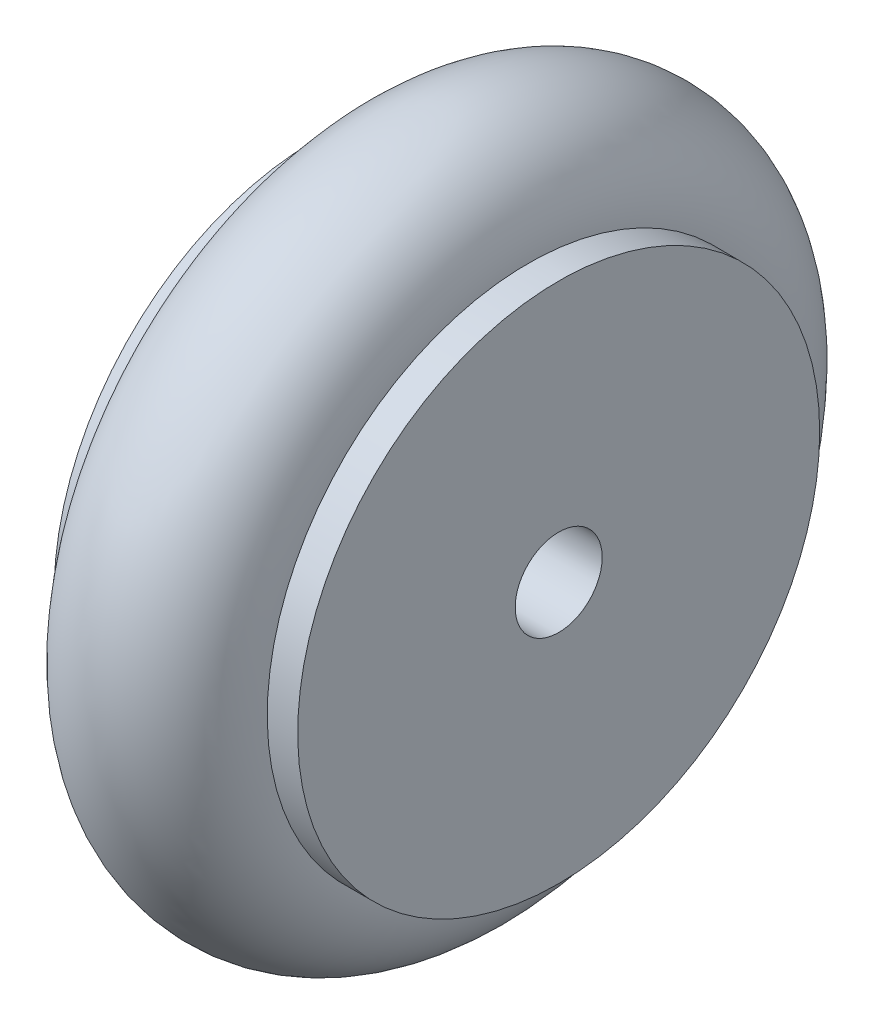
ISO-10303-21;
HEADER;
FILE_DESCRIPTION(('STEP AP214'),'2;1');
FILE_NAME('part.step','',(''),(''),'','','');
FILE_SCHEMA(('AUTOMOTIVE_DESIGN { 1 0 10303 214 1 1 1 1 }'));
ENDSEC;
DATA;
#1=APPLICATION_CONTEXT('core data for automotive mechanical design processes');
#2=APPLICATION_PROTOCOL_DEFINITION('international standard','automotive_design',2000,#1);
#3=PRODUCT_CONTEXT('',#1,'mechanical');
#4=PRODUCT('Part','Part','',(#3));
#5=PRODUCT_RELATED_PRODUCT_CATEGORY('part','',(#4));
#6=PRODUCT_DEFINITION_FORMATION('','',#4);
#7=PRODUCT_DEFINITION_CONTEXT('part definition',#1,'design');
#8=PRODUCT_DEFINITION('design','',#6,#7);
#9=PRODUCT_DEFINITION_SHAPE('','',#8);
#10=(LENGTH_UNIT() NAMED_UNIT(*) SI_UNIT(.MILLI.,.METRE.));
#11=(NAMED_UNIT(*) PLANE_ANGLE_UNIT() SI_UNIT($,.RADIAN.));
#12=(NAMED_UNIT(*) SI_UNIT($,.STERADIAN.) SOLID_ANGLE_UNIT());
#13=UNCERTAINTY_MEASURE_WITH_UNIT(LENGTH_MEASURE(1.E-05),#10,'distance_accuracy_value','');
#14=(GEOMETRIC_REPRESENTATION_CONTEXT(3) GLOBAL_UNCERTAINTY_ASSIGNED_CONTEXT((#13)) GLOBAL_UNIT_ASSIGNED_CONTEXT((#10,
#11,#12)) REPRESENTATION_CONTEXT('',''));
#15=CARTESIAN_POINT('',(0.,0.,0.));
#16=DIRECTION('',(0.,0.,1.));
#17=DIRECTION('',(1.,0.,0.));
#18=AXIS2_PLACEMENT_3D('',#15,#16,#17);
#19=CARTESIAN_POINT('',(2.8,0.,0.));
#20=DIRECTION('',(-1.,0.,0.));
#21=DIRECTION('',(0.,0.,1.));
#22=AXIS2_PLACEMENT_3D('',#19,#20,#21);
#23=CYLINDRICAL_SURFACE('',#22,3.);
#24=CARTESIAN_POINT('',(0.,0.,0.));
#25=DIRECTION('',(1.,0.,0.));
#26=DIRECTION('',(0.,0.,-1.));
#27=AXIS2_PLACEMENT_3D('',#24,#25,#26);
#28=CIRCLE('',#27,3.);
#29=CARTESIAN_POINT('',(0.,0.,-3.));
#30=VERTEX_POINT('',#29);
#31=EDGE_CURVE('E59',#30,#30,#28,.T.);
#32=ORIENTED_EDGE('',*,*,#31,.T.);
#33=EDGE_LOOP('',(#32));
#34=FACE_BOUND('',#33,.T.);
#35=CARTESIAN_POINT('',(0.349999999999998,0.,0.));
#36=DIRECTION('',(1.,0.,0.));
#37=DIRECTION('',(0.,1.,0.));
#38=AXIS2_PLACEMENT_3D('',#35,#36,#37);
#39=CIRCLE('',#38,3.);
#40=CARTESIAN_POINT('',(0.35,3.,0.));
#41=VERTEX_POINT('',#40);
#42=EDGE_CURVE('E10',#41,#41,#39,.T.);
#43=ORIENTED_EDGE('',*,*,#42,.F.);
#44=EDGE_LOOP('',(#43));
#45=FACE_BOUND('',#44,.T.);
#46=ADVANCED_FACE('F42',(#34,#45),#23,.T.);
#47=CARTESIAN_POINT('',(0.,0.,0.));
#48=DIRECTION('',(1.,0.,0.));
#49=DIRECTION('',(0.,0.,-1.));
#50=AXIS2_PLACEMENT_3D('',#47,#48,#49);
#51=PLANE('',#50);
#52=CARTESIAN_POINT('',(0.,0.,0.));
#53=DIRECTION('',(1.,0.,0.));
#54=DIRECTION('',(0.,0.,-1.));
#55=AXIS2_PLACEMENT_3D('',#52,#53,#54);
#56=CIRCLE('',#55,0.5);
#57=CARTESIAN_POINT('',(0.,0.,-0.5));
#58=VERTEX_POINT('',#57);
#59=EDGE_CURVE('E64',#58,#58,#56,.F.);
#60=ORIENTED_EDGE('',*,*,#59,.F.);
#61=EDGE_LOOP('',(#60));
#62=FACE_BOUND('',#61,.T.);
#63=ORIENTED_EDGE('',*,*,#31,.F.);
#64=EDGE_LOOP('',(#63));
#65=FACE_BOUND('',#64,.T.);
#66=ADVANCED_FACE('F92',(#62,#65),#51,.F.);
#67=CARTESIAN_POINT('',(1.4,0.,0.));
#68=DIRECTION('',(-1.,0.,0.));
#69=DIRECTION('',(0.,-1.,0.));
#70=AXIS2_PLACEMENT_3D('',#67,#68,#69);
#71=TOROIDAL_SURFACE('',#70,3.,1.05);
#72=ORIENTED_EDGE('',*,*,#42,.T.);
#73=EDGE_LOOP('',(#72));
#74=FACE_BOUND('',#73,.T.);
#75=CARTESIAN_POINT('',(2.45,0.,0.));
#76=DIRECTION('',(-1.,0.,0.));
#77=DIRECTION('',(0.,-1.,0.));
#78=AXIS2_PLACEMENT_3D('',#75,#76,#77);
#79=CIRCLE('',#78,3.);
#80=CARTESIAN_POINT('',(2.45,-3.,0.));
#81=VERTEX_POINT('',#80);
#82=EDGE_CURVE('E49',#81,#81,#79,.T.);
#83=ORIENTED_EDGE('',*,*,#82,.T.);
#84=EDGE_LOOP('',(#83));
#85=FACE_BOUND('',#84,.T.);
#86=ADVANCED_FACE('F80',(#74,#85),#71,.T.);
#87=CARTESIAN_POINT('',(2.8,0.,0.));
#88=DIRECTION('',(1.,0.,0.));
#89=DIRECTION('',(0.,0.,-1.));
#90=AXIS2_PLACEMENT_3D('',#87,#88,#89);
#91=PLANE('',#90);
#92=CARTESIAN_POINT('',(2.8,0.,0.));
#93=DIRECTION('',(1.,0.,0.));
#94=DIRECTION('',(0.,0.,-1.));
#95=AXIS2_PLACEMENT_3D('',#92,#93,#94);
#96=CIRCLE('',#95,0.5);
#97=CARTESIAN_POINT('',(2.8,0.,-0.5));
#98=VERTEX_POINT('',#97);
#99=EDGE_CURVE('E69',#98,#98,#96,.T.);
#100=ORIENTED_EDGE('',*,*,#99,.F.);
#101=EDGE_LOOP('',(#100));
#102=FACE_BOUND('',#101,.T.);
#103=CARTESIAN_POINT('',(2.8,0.,0.));
#104=DIRECTION('',(1.,0.,0.));
#105=DIRECTION('',(0.,0.,-1.));
#106=AXIS2_PLACEMENT_3D('',#103,#104,#105);
#107=CIRCLE('',#106,3.);
#108=CARTESIAN_POINT('',(2.8,0.,-3.));
#109=VERTEX_POINT('',#108);
#110=EDGE_CURVE('E54',#109,#109,#107,.T.);
#111=ORIENTED_EDGE('',*,*,#110,.T.);
#112=EDGE_LOOP('',(#111));
#113=FACE_BOUND('',#112,.T.);
#114=ADVANCED_FACE('F76',(#102,#113),#91,.T.);
#115=ORIENTED_EDGE('',*,*,#110,.F.);
#116=EDGE_LOOP('',(#115));
#117=FACE_BOUND('',#116,.T.);
#118=ORIENTED_EDGE('',*,*,#82,.F.);
#119=EDGE_LOOP('',(#118));
#120=FACE_BOUND('',#119,.T.);
#121=ADVANCED_FACE('F79',(#117,#120),#23,.T.);
#122=CARTESIAN_POINT('',(-1.41421356237309,0.,0.));
#123=DIRECTION('',(1.,0.,0.));
#124=DIRECTION('',(0.,0.,-1.));
#125=AXIS2_PLACEMENT_3D('',#122,#123,#124);
#126=CYLINDRICAL_SURFACE('',#125,0.5);
#127=ORIENTED_EDGE('',*,*,#59,.T.);
#128=EDGE_LOOP('',(#127));
#129=FACE_BOUND('',#128,.T.);
#130=ORIENTED_EDGE('',*,*,#99,.T.);
#131=EDGE_LOOP('',(#130));
#132=FACE_BOUND('',#131,.T.);
#133=ADVANCED_FACE('F74',(#129,#132),#126,.F.);
#134=CLOSED_SHELL('',(#46,#66,#86,#114,#121,#133));
#135=MANIFOLD_SOLID_BREP('B2',#134);
#136=ADVANCED_BREP_SHAPE_REPRESENTATION('',(#18,#135),#14);
#137=SHAPE_DEFINITION_REPRESENTATION(#9,#136);
ENDSEC;
END-ISO-10303-21;
